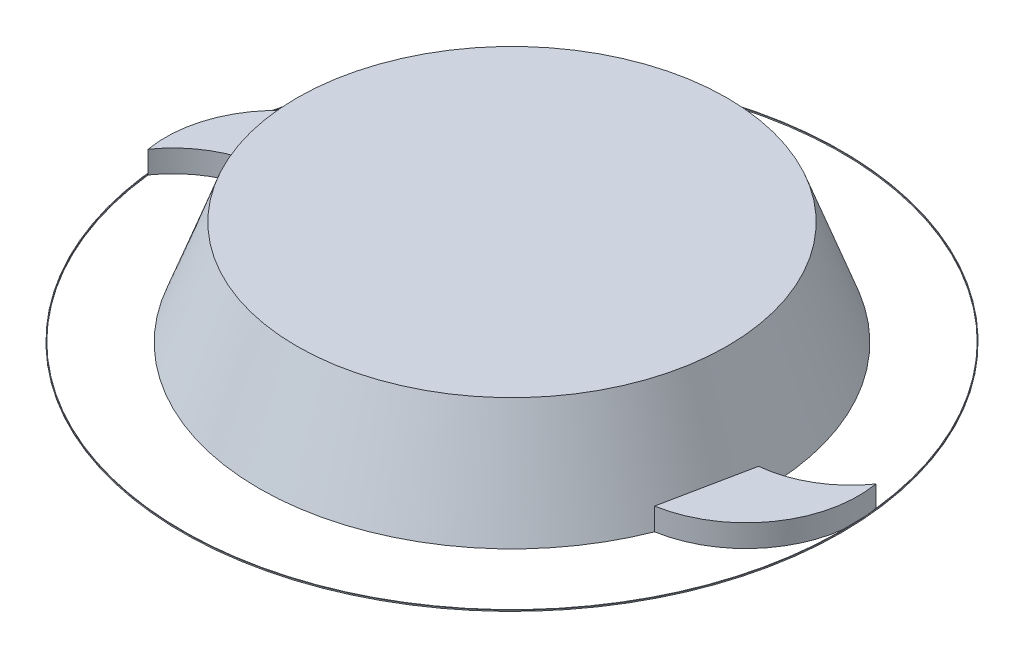
ISO-10303-21;
HEADER;
FILE_DESCRIPTION(('STEP AP214'),'2;1');
FILE_NAME('part.step','',(''),(''),'','','');
FILE_SCHEMA(('AUTOMOTIVE_DESIGN { 1 0 10303 214 1 1 1 1 }'));
ENDSEC;
DATA;
#1=APPLICATION_CONTEXT('core data for automotive mechanical design processes');
#2=APPLICATION_PROTOCOL_DEFINITION('international standard','automotive_design',2000,#1);
#3=PRODUCT_CONTEXT('',#1,'mechanical');
#4=PRODUCT('Part','Part','',(#3));
#5=PRODUCT_RELATED_PRODUCT_CATEGORY('part','',(#4));
#6=PRODUCT_DEFINITION_FORMATION('','',#4);
#7=PRODUCT_DEFINITION_CONTEXT('part definition',#1,'design');
#8=PRODUCT_DEFINITION('design','',#6,#7);
#9=PRODUCT_DEFINITION_SHAPE('','',#8);
#10=(LENGTH_UNIT() NAMED_UNIT(*) SI_UNIT(.MILLI.,.METRE.));
#11=(NAMED_UNIT(*) PLANE_ANGLE_UNIT() SI_UNIT($,.RADIAN.));
#12=(NAMED_UNIT(*) SI_UNIT($,.STERADIAN.) SOLID_ANGLE_UNIT());
#13=UNCERTAINTY_MEASURE_WITH_UNIT(LENGTH_MEASURE(1.E-05),#10,'distance_accuracy_value','');
#14=(GEOMETRIC_REPRESENTATION_CONTEXT(3) GLOBAL_UNCERTAINTY_ASSIGNED_CONTEXT((#13)) GLOBAL_UNIT_ASSIGNED_CONTEXT((#10,
#11,#12)) REPRESENTATION_CONTEXT('',''));
#15=CARTESIAN_POINT('',(0.,0.,0.));
#16=DIRECTION('',(0.,0.,1.));
#17=DIRECTION('',(1.,0.,0.));
#18=AXIS2_PLACEMENT_3D('',#15,#16,#17);
#19=CARTESIAN_POINT('',(-184.544930494829,19.05,15.2031302623928));
#20=DIRECTION('',(0.,-1.,0.));
#21=DIRECTION('',(0.,0.,-1.));
#22=AXIS2_PLACEMENT_3D('',#19,#20,#21);
#23=CYLINDRICAL_SURFACE('',#22,95.7880654539483);
#24=DIRECTION('',(0.,-1.,0.));
#25=VECTOR('',#24,1.);
#26=CARTESIAN_POINT('',(-280.33084370924,0.5,14.5610141581085));
#27=LINE('',#26,#25);
#28=CARTESIAN_POINT('',(-280.33084370924,0.,14.5610141581085));
#29=VERTEX_POINT('',#28);
#30=CARTESIAN_POINT('',(-280.33084370924,1.,14.5610141581086));
#31=VERTEX_POINT('',#30);
#32=EDGE_CURVE('E233',#29,#31,#27,.F.);
#33=ORIENTED_EDGE('',*,*,#32,.T.);
#34=CARTESIAN_POINT('',(-184.544930494829,1.,15.2031302623928));
#35=DIRECTION('',(0.,-1.,0.));
#36=DIRECTION('',(0.,0.,-1.));
#37=AXIS2_PLACEMENT_3D('',#34,#35,#36);
#38=CIRCLE('',#37,95.7880654539483);
#39=CARTESIAN_POINT('',(-278.934374009009,1.,31.5122208714185));
#40=VERTEX_POINT('',#39);
#41=EDGE_CURVE('E131',#31,#40,#38,.F.);
#42=ORIENTED_EDGE('',*,*,#41,.T.);
#43=DIRECTION('',(0.,-1.,0.));
#44=VECTOR('',#43,1.);
#45=CARTESIAN_POINT('',(-278.934374009009,19.05,31.5122208714183));
#46=LINE('',#45,#44);
#47=CARTESIAN_POINT('',(-278.934374009009,19.05,31.5122208714183));
#48=VERTEX_POINT('',#47);
#49=EDGE_CURVE('E196',#48,#40,#46,.T.);
#50=ORIENTED_EDGE('',*,*,#49,.F.);
#51=CARTESIAN_POINT('',(-184.544930494829,19.05,15.2031302623928));
#52=DIRECTION('',(0.,-1.,0.));
#53=DIRECTION('',(0.,0.,-1.));
#54=AXIS2_PLACEMENT_3D('',#51,#52,#53);
#55=CIRCLE('',#54,95.7880654539483);
#56=CARTESIAN_POINT('',(-200.854021103861,19.05,-79.1863132517857));
#57=VERTEX_POINT('',#56);
#58=EDGE_CURVE('E259',#48,#57,#55,.T.);
#59=ORIENTED_EDGE('',*,*,#58,.T.);
#60=DIRECTION('',(0.,-1.,0.));
#61=VECTOR('',#60,1.);
#62=CARTESIAN_POINT('',(-200.854021103861,19.05,-79.1863132517857));
#63=LINE('',#62,#61);
#64=CARTESIAN_POINT('',(-200.854021103861,0.,-79.1863132517857));
#65=VERTEX_POINT('',#64);
#66=EDGE_CURVE('E253',#57,#65,#63,.T.);
#67=ORIENTED_EDGE('',*,*,#66,.T.);
#68=CARTESIAN_POINT('',(-184.544930494829,0.,15.2031302623928));
#69=DIRECTION('',(0.,-1.,0.));
#70=DIRECTION('',(0.,0.,-1.));
#71=AXIS2_PLACEMENT_3D('',#68,#69,#70);
#72=CIRCLE('',#71,95.7880654539483);
#73=EDGE_CURVE('E247',#29,#65,#72,.T.);
#74=ORIENTED_EDGE('',*,*,#73,.F.);
#75=EDGE_LOOP('',(#33,#42,#50,#59,#67,#74));
#76=FACE_BOUND('',#75,.T.);
#77=ADVANCED_FACE('F45',(#76),#23,.T.);
#78=CARTESIAN_POINT('',(184.544930494829,19.05,-15.2031302623928));
#79=DIRECTION('',(0.,-1.,0.));
#80=DIRECTION('',(0.,0.,-1.));
#81=AXIS2_PLACEMENT_3D('',#78,#79,#80);
#82=CYLINDRICAL_SURFACE('',#81,95.7880654539483);
#83=DIRECTION('',(0.,-1.,0.));
#84=VECTOR('',#83,1.);
#85=CARTESIAN_POINT('',(280.33084370924,0.5,-14.5610141581085));
#86=LINE('',#85,#84);
#87=CARTESIAN_POINT('',(280.33084370924,0.,-14.5610141581085));
#88=VERTEX_POINT('',#87);
#89=CARTESIAN_POINT('',(280.33084370924,1.,-14.5610141581085));
#90=VERTEX_POINT('',#89);
#91=EDGE_CURVE('E54',#88,#90,#86,.F.);
#92=ORIENTED_EDGE('',*,*,#91,.T.);
#93=CARTESIAN_POINT('',(184.544930494829,1.,-15.2031302623928));
#94=DIRECTION('',(0.,-1.,0.));
#95=DIRECTION('',(0.,0.,-1.));
#96=AXIS2_PLACEMENT_3D('',#93,#94,#95);
#97=CIRCLE('',#96,95.7880654539483);
#98=CARTESIAN_POINT('',(278.934374009009,1.,-31.5122208714186));
#99=VERTEX_POINT('',#98);
#100=EDGE_CURVE('E12',#90,#99,#97,.F.);
#101=ORIENTED_EDGE('',*,*,#100,.T.);
#102=DIRECTION('',(0.,-1.,0.));
#103=VECTOR('',#102,1.);
#104=CARTESIAN_POINT('',(278.934374009009,19.05,-31.5122208714183));
#105=LINE('',#104,#103);
#106=CARTESIAN_POINT('',(278.934374009009,19.05,-31.5122208714183));
#107=VERTEX_POINT('',#106);
#108=EDGE_CURVE('E123',#107,#99,#105,.T.);
#109=ORIENTED_EDGE('',*,*,#108,.F.);
#110=CARTESIAN_POINT('',(184.544930494829,19.05,-15.2031302623928));
#111=DIRECTION('',(0.,-1.,0.));
#112=DIRECTION('',(0.,0.,1.));
#113=AXIS2_PLACEMENT_3D('',#110,#111,#112);
#114=CIRCLE('',#113,95.7880654539483);
#115=CARTESIAN_POINT('',(200.854021103861,19.05,79.1863132517857));
#116=VERTEX_POINT('',#115);
#117=EDGE_CURVE('E218',#107,#116,#114,.T.);
#118=ORIENTED_EDGE('',*,*,#117,.T.);
#119=DIRECTION('',(0.,-1.,0.));
#120=VECTOR('',#119,1.);
#121=CARTESIAN_POINT('',(200.854021103861,19.05,79.1863132517857));
#122=LINE('',#121,#120);
#123=CARTESIAN_POINT('',(200.854021103861,0.,79.1863132517857));
#124=VERTEX_POINT('',#123);
#125=EDGE_CURVE('E144',#116,#124,#122,.T.);
#126=ORIENTED_EDGE('',*,*,#125,.T.);
#127=CARTESIAN_POINT('',(184.544930494829,0.,-15.2031302623928));
#128=DIRECTION('',(0.,-1.,0.));
#129=DIRECTION('',(0.,0.,1.));
#130=AXIS2_PLACEMENT_3D('',#127,#128,#129);
#131=CIRCLE('',#130,95.7880654539483);
#132=EDGE_CURVE('E217',#88,#124,#131,.T.);
#133=ORIENTED_EDGE('',*,*,#132,.F.);
#134=EDGE_LOOP('',(#92,#101,#109,#118,#126,#133));
#135=FACE_BOUND('',#134,.T.);
#136=ADVANCED_FACE('F136',(#135),#82,.T.);
#137=CARTESIAN_POINT('',(0.,0.,0.));
#138=DIRECTION('',(0.,-1.,0.));
#139=DIRECTION('',(0.,0.,1.));
#140=AXIS2_PLACEMENT_3D('',#137,#138,#139);
#141=CONICAL_SURFACE('',#140,215.9,0.349065850398867);
#142=CARTESIAN_POINT('',(0.,88.9,0.));
#143=DIRECTION('',(0.,1.,0.));
#144=DIRECTION('',(0.,0.,1.));
#145=AXIS2_PLACEMENT_3D('',#142,#143,#144);
#146=CIRCLE('',#145,183.543046173734);
#147=CARTESIAN_POINT('',(0.,88.9,183.543046173734));
#148=VERTEX_POINT('',#147);
#149=EDGE_CURVE('E201',#148,#148,#146,.T.);
#150=ORIENTED_EDGE('',*,*,#149,.F.);
#151=EDGE_LOOP('',(#150));
#152=FACE_BOUND('',#151,.T.);
#153=CARTESIAN_POINT('',(0.,0.,0.));
#154=DIRECTION('',(0.,1.,0.));
#155=DIRECTION('',(0.,0.,1.));
#156=AXIS2_PLACEMENT_3D('',#153,#154,#155);
#157=CIRCLE('',#156,215.9);
#158=CARTESIAN_POINT('',(-215.831259209611,0.,-5.44771034414039));
#159=VERTEX_POINT('',#158);
#160=EDGE_CURVE('E198',#159,#124,#157,.T.);
#161=ORIENTED_EDGE('',*,*,#160,.T.);
#162=CARTESIAN_POINT('',(200.853980481344,-9.77089891891834E-05,79.1865132517857));
#163=CARTESIAN_POINT('',(201.07327913983,0.527361697201641,78.1068230858099));
#164=CARTESIAN_POINT('',(201.294297794422,1.03652155211555,77.018664729036));
#165=CARTESIAN_POINT('',(201.739788546171,2.01572348925577,74.8253454127322));
#166=CARTESIAN_POINT('',(201.964261283393,2.48575821531528,73.7201813019144));
#167=CARTESIAN_POINT('',(202.643301157097,3.83418974688245,70.3770114029019));
#168=CARTESIAN_POINT('',(203.102961499073,4.64963043671013,68.1139298393934));
#169=CARTESIAN_POINT('',(203.800392657692,5.72893029666773,64.680212694905));
#170=CARTESIAN_POINT('',(204.033865028729,6.06435535117218,63.5307399859677));
#171=CARTESIAN_POINT('',(204.50341008985,6.68543451878584,61.2189922147984));
#172=CARTESIAN_POINT('',(204.739482456942,6.97109474155828,60.0567187427796));
#173=CARTESIAN_POINT('',(205.213801256784,7.4902195491519,57.7214680519473));
#174=CARTESIAN_POINT('',(205.452046871279,7.72370299818919,56.5484948617156));
#175=CARTESIAN_POINT('',(205.930366549497,8.13656505172742,54.1935463347595));
#176=CARTESIAN_POINT('',(206.170440408134,8.31594963577376,53.0115720077476));
#177=CARTESIAN_POINT('',(206.654224233282,8.62041514679612,50.6297214206198));
#178=CARTESIAN_POINT('',(206.897947238199,8.74497460703999,49.429780967503));
#179=CARTESIAN_POINT('',(207.386295145424,8.9361286518082,47.0254596796029));
#180=CARTESIAN_POINT('',(207.630920050487,9.00272305909046,45.8210788312532));
#181=CARTESIAN_POINT('',(208.12056979712,9.07729219672929,43.4103480959918));
#182=CARTESIAN_POINT('',(208.365594704242,9.08525609260145,42.203997886351));
#183=CARTESIAN_POINT('',(208.855439535593,9.0424559248632,39.7923066753083));
#184=CARTESIAN_POINT('',(209.100259460756,8.99169213035229,38.5869656693075));
#185=CARTESIAN_POINT('',(209.589088685152,8.8319609685536,36.1802746750875));
#186=CARTESIAN_POINT('',(209.833098154387,8.7230067001187,34.9789238498814));
#187=CARTESIAN_POINT('',(210.31983861103,8.44796528071767,32.5825166486302));
#188=CARTESIAN_POINT('',(210.562569576843,8.28187716783099,31.3874603789059));
#189=CARTESIAN_POINT('',(211.046214647732,7.8941712086735,29.0062929314253));
#190=CARTESIAN_POINT('',(211.28712910986,7.67256458451274,27.8201799957782));
#191=CARTESIAN_POINT('',(211.766737084896,7.17582130999048,25.4588886967514));
#192=CARTESIAN_POINT('',(212.005430725471,6.90068775684223,24.2837097048246));
#193=CARTESIAN_POINT('',(212.552476495316,6.20767775091953,21.5903966580506));
#194=CARTESIAN_POINT('',(212.859931248494,5.77183890320427,20.0766807248037));
#195=CARTESIAN_POINT('',(213.469729237843,4.81885101805416,17.0744147881211));
#196=CARTESIAN_POINT('',(213.772073241986,4.30171431941591,15.5858610036657));
#197=CARTESIAN_POINT('',(214.370656315748,3.19325119271724,12.6388103343972));
#198=CARTESIAN_POINT('',(214.666905783801,2.60206591224696,11.1802622541623));
#199=CARTESIAN_POINT('',(215.253550693351,1.35098879826116,8.29198767858946));
#200=CARTESIAN_POINT('',(215.543947095609,0.69110835227189,6.86225645306506));
#201=CARTESIAN_POINT('',(215.831299832128,-9.77089891347206E-05,5.44751034414039));
#202=B_SPLINE_CURVE_WITH_KNOTS('',3,(#162,#163,#164,#165,#166,#167,#168,#169,#170,#171,#172,
#173,#174,#175,#176,#177,#178,#179,#180,#181,#182,#183,#184,#185,#186,#187,#188,#189,#190,#191,
#192,#193,#194,#195,#196,#197,#198,#199,#200,#201),.UNSPECIFIED.,.F.,.F.,(4,2,2,2,2,2,2,2,2,2,2,
2,2,2,2,2,2,2,2,4),(0.,3.66403801759775,7.32876338574285,14.6670414726924,18.3260805949506,
21.9846701773469,25.6419348697224,29.2987951764971,32.9897231402174,36.680662389798,
40.3722836805076,44.0638880556948,47.7546617895229,51.4454976652379,55.1355881031796,
58.8254650859529,63.6377705228237,68.4493462868455,73.2518862024852,78.0536312699569),.UNSPECIFIED.);
#203=CARTESIAN_POINT('',(215.831259209611,0.,5.44771034414039));
#204=VERTEX_POINT('',#203);
#205=EDGE_CURVE('E150',#124,#204,#202,.T.);
#206=ORIENTED_EDGE('',*,*,#205,.T.);
#207=EDGE_CURVE('E194',#204,#65,#157,.T.);
#208=ORIENTED_EDGE('',*,*,#207,.T.);
#209=CARTESIAN_POINT('',(-200.853980481344,-9.77089891891834E-05,-79.1865132517857));
#210=CARTESIAN_POINT('',(-201.07327913983,0.527361697201641,-78.1068230858099));
#211=CARTESIAN_POINT('',(-201.294297794422,1.03652155211555,-77.018664729036));
#212=CARTESIAN_POINT('',(-201.739788546171,2.01572348925577,-74.8253454127322));
#213=CARTESIAN_POINT('',(-201.964261283393,2.48575821531528,-73.7201813019144));
#214=CARTESIAN_POINT('',(-202.643301157097,3.83418974688245,-70.3770114029019));
#215=CARTESIAN_POINT('',(-203.102961499073,4.64963043671013,-68.1139298393934));
#216=CARTESIAN_POINT('',(-203.800392657692,5.72893029666773,-64.680212694905));
#217=CARTESIAN_POINT('',(-204.033865028729,6.06435535117218,-63.5307399859677));
#218=CARTESIAN_POINT('',(-204.50341008985,6.68543451878584,-61.2189922147984));
#219=CARTESIAN_POINT('',(-204.739482456942,6.97109474155828,-60.0567187427796));
#220=CARTESIAN_POINT('',(-205.213801256784,7.4902195491519,-57.7214680519473));
#221=CARTESIAN_POINT('',(-205.452046871279,7.72370299818919,-56.5484948617156));
#222=CARTESIAN_POINT('',(-205.930366549497,8.13656505172742,-54.1935463347595));
#223=CARTESIAN_POINT('',(-206.170440408134,8.31594963577376,-53.0115720077476));
#224=CARTESIAN_POINT('',(-206.654224233282,8.62041514679612,-50.6297214206198));
#225=CARTESIAN_POINT('',(-206.897947238199,8.74497460703999,-49.429780967503));
#226=CARTESIAN_POINT('',(-207.386295145424,8.9361286518082,-47.0254596796029));
#227=CARTESIAN_POINT('',(-207.630920050487,9.00272305909046,-45.8210788312532));
#228=CARTESIAN_POINT('',(-208.12056979712,9.07729219672929,-43.4103480959918));
#229=CARTESIAN_POINT('',(-208.365594704242,9.08525609260145,-42.203997886351));
#230=CARTESIAN_POINT('',(-208.855439535593,9.0424559248632,-39.7923066753083));
#231=CARTESIAN_POINT('',(-209.100259460756,8.99169213035229,-38.5869656693075));
#232=CARTESIAN_POINT('',(-209.589088685152,8.8319609685536,-36.1802746750875));
#233=CARTESIAN_POINT('',(-209.833098154387,8.7230067001187,-34.9789238498814));
#234=CARTESIAN_POINT('',(-210.31983861103,8.44796528071767,-32.5825166486302));
#235=CARTESIAN_POINT('',(-210.562569576843,8.28187716783099,-31.3874603789059));
#236=CARTESIAN_POINT('',(-211.046214647732,7.8941712086735,-29.0062929314253));
#237=CARTESIAN_POINT('',(-211.28712910986,7.67256458451274,-27.8201799957782));
#238=CARTESIAN_POINT('',(-211.766737084896,7.17582130999048,-25.4588886967514));
#239=CARTESIAN_POINT('',(-212.005430725471,6.90068775684223,-24.2837097048246));
#240=CARTESIAN_POINT('',(-212.552476495316,6.20767775091953,-21.5903966580506));
#241=CARTESIAN_POINT('',(-212.859931248494,5.77183890320427,-20.0766807248037));
#242=CARTESIAN_POINT('',(-213.469729237843,4.81885101805416,-17.0744147881211));
#243=CARTESIAN_POINT('',(-213.772073241986,4.30171431941591,-15.5858610036657));
#244=CARTESIAN_POINT('',(-214.370656315748,3.19325119271724,-12.6388103343972));
#245=CARTESIAN_POINT('',(-214.666905783801,2.60206591224696,-11.1802622541623));
#246=CARTESIAN_POINT('',(-215.253550693351,1.35098879826116,-8.29198767858946));
#247=CARTESIAN_POINT('',(-215.543947095609,0.69110835227189,-6.86225645306506));
#248=CARTESIAN_POINT('',(-215.831299832128,-9.77089891347206E-05,-5.44751034414039));
#249=B_SPLINE_CURVE_WITH_KNOTS('',3,(#209,#210,#211,#212,#213,#214,#215,#216,#217,#218,#219,
#220,#221,#222,#223,#224,#225,#226,#227,#228,#229,#230,#231,#232,#233,#234,#235,#236,#237,#238,
#239,#240,#241,#242,#243,#244,#245,#246,#247,#248),.UNSPECIFIED.,.F.,.F.,(4,2,2,2,2,2,2,2,2,2,2,
2,2,2,2,2,2,2,2,4),(0.,3.66403801759775,7.32876338574285,14.6670414726924,18.3260805949506,
21.9846701773469,25.6419348697224,29.2987951764971,32.9897231402174,36.680662389798,
40.3722836805076,44.0638880556948,47.7546617895229,51.4454976652379,55.1355881031796,
58.8254650859529,63.6377705228237,68.4493462868455,73.2518862024852,78.0536312699569),.UNSPECIFIED.);
#250=EDGE_CURVE('E186',#65,#159,#249,.T.);
#251=ORIENTED_EDGE('',*,*,#250,.T.);
#252=EDGE_LOOP('',(#161,#206,#208,#251));
#253=FACE_BOUND('',#252,.T.);
#254=ADVANCED_FACE('F47',(#152,#253),#141,.T.);
#255=CARTESIAN_POINT('',(0.,88.9,0.));
#256=DIRECTION('',(0.,1.,0.));
#257=DIRECTION('',(0.,0.,1.));
#258=AXIS2_PLACEMENT_3D('',#255,#256,#257);
#259=PLANE('',#258);
#260=ORIENTED_EDGE('',*,*,#149,.T.);
#261=EDGE_LOOP('',(#260));
#262=FACE_BOUND('',#261,.T.);
#263=ADVANCED_FACE('F205',(#262),#259,.T.);
#264=CARTESIAN_POINT('',(0.,0.,0.));
#265=DIRECTION('',(0.,1.,0.));
#266=DIRECTION('',(0.,0.,1.));
#267=AXIS2_PLACEMENT_3D('',#264,#265,#266);
#268=PLANE('',#267);
#269=CARTESIAN_POINT('',(206.729360528104,0.,-82.4414673945508));
#270=DIRECTION('',(0.,1.,0.));
#271=DIRECTION('',(0.,0.,-1.));
#272=AXIS2_PLACEMENT_3D('',#269,#270,#271);
#273=CIRCLE('',#272,88.3592220608108);
#274=CARTESIAN_POINT('',(278.934374009009,0.,-31.5122208714186));
#275=VERTEX_POINT('',#274);
#276=EDGE_CURVE('E225',#204,#275,#273,.T.);
#277=ORIENTED_EDGE('',*,*,#276,.T.);
#278=CARTESIAN_POINT('',(0.,0.,0.));
#279=DIRECTION('',(0.,-1.,0.));
#280=DIRECTION('',(0.,0.,-1.));
#281=AXIS2_PLACEMENT_3D('',#278,#279,#280);
#282=CIRCLE('',#281,280.708754883147);
#283=EDGE_CURVE('E118',#29,#275,#282,.T.);
#284=ORIENTED_EDGE('',*,*,#283,.F.);
#285=ORIENTED_EDGE('',*,*,#73,.T.);
#286=ORIENTED_EDGE('',*,*,#207,.F.);
#287=EDGE_LOOP('',(#277,#284,#285,#286));
#288=FACE_BOUND('',#287,.T.);
#289=CARTESIAN_POINT('',(-278.934374009009,0.,31.5122208714185));
#290=VERTEX_POINT('',#289);
#291=EDGE_CURVE('E133',#88,#290,#282,.T.);
#292=ORIENTED_EDGE('',*,*,#291,.F.);
#293=ORIENTED_EDGE('',*,*,#132,.T.);
#294=ORIENTED_EDGE('',*,*,#160,.F.);
#295=CARTESIAN_POINT('',(-206.729360528104,0.,82.4414673945508));
#296=DIRECTION('',(0.,1.,0.));
#297=DIRECTION('',(0.,0.,1.));
#298=AXIS2_PLACEMENT_3D('',#295,#296,#297);
#299=CIRCLE('',#298,88.3592220608108);
#300=EDGE_CURVE('E158',#159,#290,#299,.T.);
#301=ORIENTED_EDGE('',*,*,#300,.T.);
#302=EDGE_LOOP('',(#292,#293,#294,#301));
#303=FACE_BOUND('',#302,.T.);
#304=CARTESIAN_POINT('',(0.,0.,0.));
#305=DIRECTION('',(0.,-1.,0.));
#306=DIRECTION('',(1.,0.,0.));
#307=AXIS2_PLACEMENT_3D('',#304,#305,#306);
#308=CIRCLE('',#307,281.208754883147);
#309=CARTESIAN_POINT('',(281.208754883147,0.,0.));
#310=VERTEX_POINT('',#309);
#311=EDGE_CURVE('E236',#310,#310,#308,.T.);
#312=ORIENTED_EDGE('',*,*,#311,.T.);
#313=EDGE_LOOP('',(#312));
#314=FACE_BOUND('',#313,.T.);
#315=ADVANCED_FACE('F182',(#288,#303,#314),#268,.F.);
#316=CARTESIAN_POINT('',(-215.831259209611,19.05,-5.44771034414039));
#317=DIRECTION('',(0.979989693297243,0.,0.199048237950444));
#318=DIRECTION('',(0.199048237950444,0.,-0.979989693297243));
#319=AXIS2_PLACEMENT_3D('',#316,#317,#318);
#320=PLANE('',#319);
#321=ORIENTED_EDGE('',*,*,#250,.F.);
#322=ORIENTED_EDGE('',*,*,#66,.F.);
#323=DIRECTION('',(-0.199048237950444,0.,0.979989693297243));
#324=VECTOR('',#323,1.);
#325=CARTESIAN_POINT('',(-215.831259209611,19.05,-5.44771034414039));
#326=LINE('',#325,#324);
#327=CARTESIAN_POINT('',(-215.831259209611,19.05,-5.44771034414039));
#328=VERTEX_POINT('',#327);
#329=EDGE_CURVE('E251',#57,#328,#326,.T.);
#330=ORIENTED_EDGE('',*,*,#329,.T.);
#331=DIRECTION('',(0.,-1.,0.));
#332=VECTOR('',#331,1.);
#333=CARTESIAN_POINT('',(-215.831259209611,19.05,-5.44771034414039));
#334=LINE('',#333,#332);
#335=EDGE_CURVE('E195',#328,#159,#334,.T.);
#336=ORIENTED_EDGE('',*,*,#335,.T.);
#337=EDGE_LOOP('',(#321,#322,#330,#336));
#338=FACE_BOUND('',#337,.T.);
#339=ADVANCED_FACE('F178',(#338),#320,.T.);
#340=CARTESIAN_POINT('',(-206.729360528104,19.05,82.4414673945508));
#341=DIRECTION('',(0.,-1.,0.));
#342=DIRECTION('',(0.,0.,-1.));
#343=AXIS2_PLACEMENT_3D('',#340,#341,#342);
#344=CYLINDRICAL_SURFACE('',#343,88.3592220608108);
#345=ORIENTED_EDGE('',*,*,#300,.F.);
#346=ORIENTED_EDGE('',*,*,#335,.F.);
#347=CARTESIAN_POINT('',(-206.729360528104,19.05,82.4414673945508));
#348=DIRECTION('',(0.,1.,0.));
#349=DIRECTION('',(0.,0.,1.));
#350=AXIS2_PLACEMENT_3D('',#347,#348,#349);
#351=CIRCLE('',#350,88.3592220608108);
#352=EDGE_CURVE('E159',#328,#48,#351,.T.);
#353=ORIENTED_EDGE('',*,*,#352,.T.);
#354=ORIENTED_EDGE('',*,*,#49,.T.);
#355=DIRECTION('',(0.,-1.,0.));
#356=VECTOR('',#355,1.);
#357=CARTESIAN_POINT('',(-278.934374009009,0.5,31.5122208714185));
#358=LINE('',#357,#356);
#359=EDGE_CURVE('E230',#40,#290,#358,.T.);
#360=ORIENTED_EDGE('',*,*,#359,.T.);
#361=EDGE_LOOP('',(#345,#346,#353,#354,#360));
#362=FACE_BOUND('',#361,.T.);
#363=ADVANCED_FACE('F176',(#362),#344,.F.);
#364=CARTESIAN_POINT('',(-206.729360528104,19.05,82.4414673945508));
#365=DIRECTION('',(0.,1.,0.));
#366=DIRECTION('',(0.,0.,1.));
#367=AXIS2_PLACEMENT_3D('',#364,#365,#366);
#368=PLANE('',#367);
#369=ORIENTED_EDGE('',*,*,#352,.F.);
#370=ORIENTED_EDGE('',*,*,#329,.F.);
#371=ORIENTED_EDGE('',*,*,#58,.F.);
#372=EDGE_LOOP('',(#369,#370,#371));
#373=FACE_BOUND('',#372,.T.);
#374=ADVANCED_FACE('F166',(#373),#368,.T.);
#375=CARTESIAN_POINT('',(215.831259209611,19.05,5.44771034414039));
#376=DIRECTION('',(-0.979989693297243,0.,-0.199048237950444));
#377=DIRECTION('',(-0.199048237950444,0.,0.979989693297243));
#378=AXIS2_PLACEMENT_3D('',#375,#376,#377);
#379=PLANE('',#378);
#380=ORIENTED_EDGE('',*,*,#205,.F.);
#381=ORIENTED_EDGE('',*,*,#125,.F.);
#382=DIRECTION('',(0.199048237950444,0.,-0.979989693297243));
#383=VECTOR('',#382,1.);
#384=CARTESIAN_POINT('',(215.831259209611,19.05,5.44771034414039));
#385=LINE('',#384,#383);
#386=CARTESIAN_POINT('',(215.831259209611,19.05,5.44771034414039));
#387=VERTEX_POINT('',#386);
#388=EDGE_CURVE('E124',#116,#387,#385,.T.);
#389=ORIENTED_EDGE('',*,*,#388,.T.);
#390=DIRECTION('',(0.,-1.,0.));
#391=VECTOR('',#390,1.);
#392=CARTESIAN_POINT('',(215.831259209611,19.05,5.44771034414039));
#393=LINE('',#392,#391);
#394=EDGE_CURVE('E146',#387,#204,#393,.T.);
#395=ORIENTED_EDGE('',*,*,#394,.T.);
#396=EDGE_LOOP('',(#380,#381,#389,#395));
#397=FACE_BOUND('',#396,.T.);
#398=ADVANCED_FACE('F161',(#397),#379,.T.);
#399=CARTESIAN_POINT('',(206.729360528104,19.05,-82.4414673945508));
#400=DIRECTION('',(0.,-1.,0.));
#401=DIRECTION('',(0.,0.,-1.));
#402=AXIS2_PLACEMENT_3D('',#399,#400,#401);
#403=CYLINDRICAL_SURFACE('',#402,88.3592220608108);
#404=ORIENTED_EDGE('',*,*,#276,.F.);
#405=ORIENTED_EDGE('',*,*,#394,.F.);
#406=CARTESIAN_POINT('',(206.729360528104,19.05,-82.4414673945508));
#407=DIRECTION('',(0.,1.,0.));
#408=DIRECTION('',(0.,0.,-1.));
#409=AXIS2_PLACEMENT_3D('',#406,#407,#408);
#410=CIRCLE('',#409,88.3592220608108);
#411=EDGE_CURVE('E143',#387,#107,#410,.T.);
#412=ORIENTED_EDGE('',*,*,#411,.T.);
#413=ORIENTED_EDGE('',*,*,#108,.T.);
#414=EDGE_CURVE('E115',#99,#275,#105,.T.);
#415=ORIENTED_EDGE('',*,*,#414,.T.);
#416=EDGE_LOOP('',(#404,#405,#412,#413,#415));
#417=FACE_BOUND('',#416,.T.);
#418=ADVANCED_FACE('F141',(#417),#403,.F.);
#419=CARTESIAN_POINT('',(206.729360528104,19.05,-82.4414673945508));
#420=DIRECTION('',(0.,1.,0.));
#421=DIRECTION('',(0.,0.,-1.));
#422=AXIS2_PLACEMENT_3D('',#419,#420,#421);
#423=PLANE('',#422);
#424=ORIENTED_EDGE('',*,*,#411,.F.);
#425=ORIENTED_EDGE('',*,*,#388,.F.);
#426=ORIENTED_EDGE('',*,*,#117,.F.);
#427=EDGE_LOOP('',(#424,#425,#426));
#428=FACE_BOUND('',#427,.T.);
#429=ADVANCED_FACE('F168',(#428),#423,.T.);
#430=CARTESIAN_POINT('',(0.,1.,0.));
#431=DIRECTION('',(0.,-1.,0.));
#432=DIRECTION('',(0.,0.,-1.));
#433=AXIS2_PLACEMENT_3D('',#430,#431,#432);
#434=CYLINDRICAL_SURFACE('',#433,280.708754883147);
#435=ORIENTED_EDGE('',*,*,#359,.F.);
#436=CARTESIAN_POINT('',(0.,1.,0.));
#437=DIRECTION('',(0.,-1.,0.));
#438=DIRECTION('',(0.,0.,-1.));
#439=AXIS2_PLACEMENT_3D('',#436,#437,#438);
#440=CIRCLE('',#439,280.708754883147);
#441=EDGE_CURVE('E69',#90,#40,#440,.T.);
#442=ORIENTED_EDGE('',*,*,#441,.F.);
#443=ORIENTED_EDGE('',*,*,#91,.F.);
#444=ORIENTED_EDGE('',*,*,#291,.T.);
#445=EDGE_LOOP('',(#435,#442,#443,#444));
#446=FACE_BOUND('',#445,.T.);
#447=ADVANCED_FACE('F241',(#446),#434,.F.);
#448=CARTESIAN_POINT('',(0.,1.,0.));
#449=DIRECTION('',(0.,-1.,0.));
#450=DIRECTION('',(0.,0.,-1.));
#451=AXIS2_PLACEMENT_3D('',#448,#449,#450);
#452=CYLINDRICAL_SURFACE('',#451,281.208754883147);
#453=CARTESIAN_POINT('',(0.,1.,0.));
#454=DIRECTION('',(0.,-1.,0.));
#455=DIRECTION('',(1.,0.,0.));
#456=AXIS2_PLACEMENT_3D('',#453,#454,#455);
#457=CIRCLE('',#456,281.208754883147);
#458=CARTESIAN_POINT('',(281.208754883147,1.,0.));
#459=VERTEX_POINT('',#458);
#460=EDGE_CURVE('E235',#459,#459,#457,.T.);
#461=ORIENTED_EDGE('',*,*,#460,.T.);
#462=EDGE_LOOP('',(#461));
#463=FACE_BOUND('',#462,.T.);
#464=ORIENTED_EDGE('',*,*,#311,.F.);
#465=EDGE_LOOP('',(#464));
#466=FACE_BOUND('',#465,.T.);
#467=ADVANCED_FACE('F349',(#463,#466),#452,.T.);
#468=CARTESIAN_POINT('',(0.,1.,0.));
#469=DIRECTION('',(0.,-1.,0.));
#470=DIRECTION('',(0.,0.,-1.));
#471=AXIS2_PLACEMENT_3D('',#468,#469,#470);
#472=PLANE('',#471);
#473=ORIENTED_EDGE('',*,*,#41,.F.);
#474=EDGE_CURVE('E61',#31,#99,#440,.T.);
#475=ORIENTED_EDGE('',*,*,#474,.T.);
#476=ORIENTED_EDGE('',*,*,#100,.F.);
#477=ORIENTED_EDGE('',*,*,#441,.T.);
#478=EDGE_LOOP('',(#473,#475,#476,#477));
#479=FACE_BOUND('',#478,.T.);
#480=ORIENTED_EDGE('',*,*,#460,.F.);
#481=EDGE_LOOP('',(#480));
#482=FACE_BOUND('',#481,.T.);
#483=ADVANCED_FACE('F127',(#479,#482),#472,.F.);
#484=ORIENTED_EDGE('',*,*,#32,.F.);
#485=ORIENTED_EDGE('',*,*,#283,.T.);
#486=ORIENTED_EDGE('',*,*,#414,.F.);
#487=ORIENTED_EDGE('',*,*,#474,.F.);
#488=EDGE_LOOP('',(#484,#485,#486,#487));
#489=FACE_BOUND('',#488,.T.);
#490=ADVANCED_FACE('F116',(#489),#434,.F.);
#491=CLOSED_SHELL('',(#77,#136,#254,#263,#315,#339,#363,#374,#398,#418,#429,#447,#467,#483,#490));
#492=MANIFOLD_SOLID_BREP('B2',#491);
#493=ADVANCED_BREP_SHAPE_REPRESENTATION('',(#18,#492),#14);
#494=SHAPE_DEFINITION_REPRESENTATION(#9,#493);
ENDSEC;
END-ISO-10303-21;
